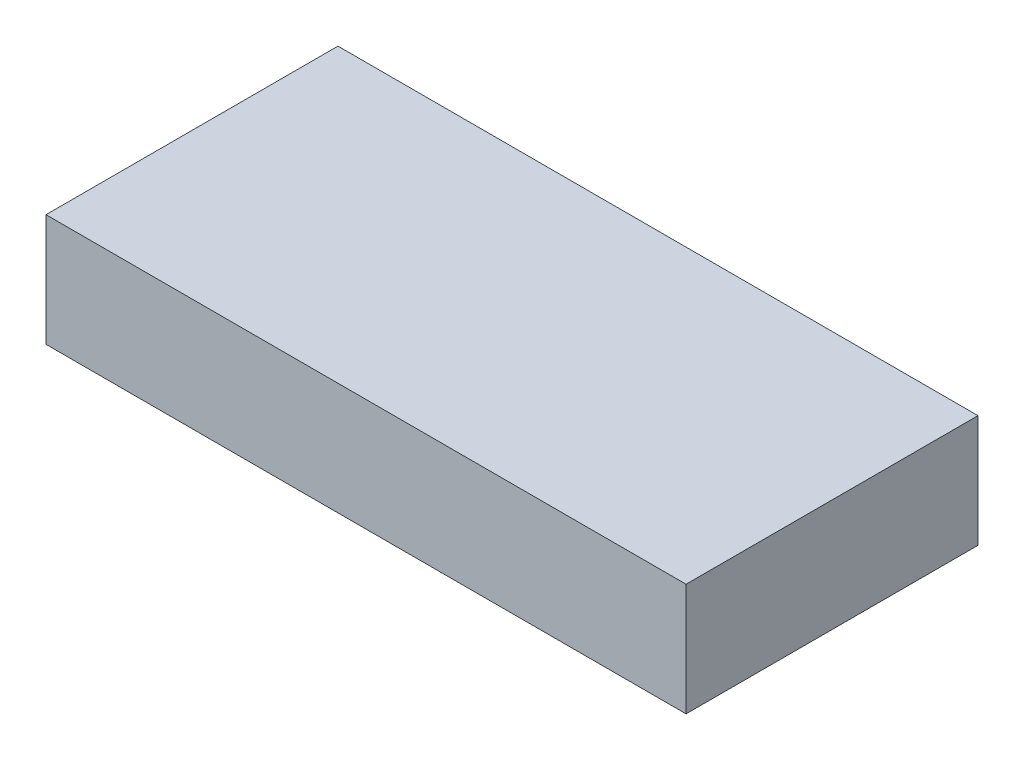
ISO-10303-21;
HEADER;
FILE_DESCRIPTION(('STEP AP214'),'2;1');
FILE_NAME('part.step','',(''),(''),'','','');
FILE_SCHEMA(('AUTOMOTIVE_DESIGN { 1 0 10303 214 1 1 1 1 }'));
ENDSEC;
DATA;
#1=APPLICATION_CONTEXT('core data for automotive mechanical design processes');
#2=APPLICATION_PROTOCOL_DEFINITION('international standard','automotive_design',2000,#1);
#3=PRODUCT_CONTEXT('',#1,'mechanical');
#4=PRODUCT('Part','Part','',(#3));
#5=PRODUCT_RELATED_PRODUCT_CATEGORY('part','',(#4));
#6=PRODUCT_DEFINITION_FORMATION('','',#4);
#7=PRODUCT_DEFINITION_CONTEXT('part definition',#1,'design');
#8=PRODUCT_DEFINITION('design','',#6,#7);
#9=PRODUCT_DEFINITION_SHAPE('','',#8);
#10=(LENGTH_UNIT() NAMED_UNIT(*) SI_UNIT(.MILLI.,.METRE.));
#11=(NAMED_UNIT(*) PLANE_ANGLE_UNIT() SI_UNIT($,.RADIAN.));
#12=(NAMED_UNIT(*) SI_UNIT($,.STERADIAN.) SOLID_ANGLE_UNIT());
#13=UNCERTAINTY_MEASURE_WITH_UNIT(LENGTH_MEASURE(1.E-05),#10,'distance_accuracy_value','');
#14=(GEOMETRIC_REPRESENTATION_CONTEXT(3) GLOBAL_UNCERTAINTY_ASSIGNED_CONTEXT((#13)) GLOBAL_UNIT_ASSIGNED_CONTEXT((#10,
#11,#12)) REPRESENTATION_CONTEXT('',''));
#15=CARTESIAN_POINT('',(0.,0.,0.));
#16=DIRECTION('',(0.,0.,1.));
#17=DIRECTION('',(1.,0.,0.));
#18=AXIS2_PLACEMENT_3D('',#15,#16,#17);
#19=CARTESIAN_POINT('',(0.,5.,0.));
#20=DIRECTION('',(1.,0.,0.));
#21=DIRECTION('',(0.,0.,-1.));
#22=AXIS2_PLACEMENT_3D('',#19,#20,#21);
#23=PLANE('',#22);
#24=DIRECTION('',(0.,0.,1.));
#25=VECTOR('',#24,1.);
#26=CARTESIAN_POINT('',(0.,0.,0.));
#27=LINE('',#26,#25);
#28=CARTESIAN_POINT('',(0.,0.,-13.));
#29=VERTEX_POINT('',#28);
#30=CARTESIAN_POINT('',(0.,0.,0.));
#31=VERTEX_POINT('',#30);
#32=EDGE_CURVE('E97',#29,#31,#27,.T.);
#33=ORIENTED_EDGE('',*,*,#32,.T.);
#34=DIRECTION('',(0.,-1.,0.));
#35=VECTOR('',#34,1.);
#36=CARTESIAN_POINT('',(0.,5.,0.));
#37=LINE('',#36,#35);
#38=CARTESIAN_POINT('',(0.,5.,0.));
#39=VERTEX_POINT('',#38);
#40=EDGE_CURVE('E11',#39,#31,#37,.T.);
#41=ORIENTED_EDGE('',*,*,#40,.F.);
#42=DIRECTION('',(0.,0.,1.));
#43=VECTOR('',#42,1.);
#44=CARTESIAN_POINT('',(0.,5.,0.));
#45=LINE('',#44,#43);
#46=CARTESIAN_POINT('',(0.,5.,-13.));
#47=VERTEX_POINT('',#46);
#48=EDGE_CURVE('E85',#47,#39,#45,.T.);
#49=ORIENTED_EDGE('',*,*,#48,.F.);
#50=DIRECTION('',(0.,-1.,0.));
#51=VECTOR('',#50,1.);
#52=CARTESIAN_POINT('',(0.,5.,-13.));
#53=LINE('',#52,#51);
#54=EDGE_CURVE('E93',#47,#29,#53,.T.);
#55=ORIENTED_EDGE('',*,*,#54,.T.);
#56=EDGE_LOOP('',(#33,#41,#49,#55));
#57=FACE_BOUND('',#56,.T.);
#58=ADVANCED_FACE('F34',(#57),#23,.F.);
#59=CARTESIAN_POINT('',(0.,5.,0.));
#60=DIRECTION('',(0.,0.,-1.));
#61=DIRECTION('',(-1.,0.,0.));
#62=AXIS2_PLACEMENT_3D('',#59,#60,#61);
#63=PLANE('',#62);
#64=DIRECTION('',(1.,0.,0.));
#65=VECTOR('',#64,1.);
#66=CARTESIAN_POINT('',(0.,0.,0.));
#67=LINE('',#66,#65);
#68=CARTESIAN_POINT('',(28.5,0.,0.));
#69=VERTEX_POINT('',#68);
#70=EDGE_CURVE('E89',#31,#69,#67,.T.);
#71=ORIENTED_EDGE('',*,*,#70,.T.);
#72=DIRECTION('',(0.,-1.,0.));
#73=VECTOR('',#72,1.);
#74=CARTESIAN_POINT('',(28.5,5.,0.));
#75=LINE('',#74,#73);
#76=CARTESIAN_POINT('',(28.5,5.,0.));
#77=VERTEX_POINT('',#76);
#78=EDGE_CURVE('E42',#77,#69,#75,.T.);
#79=ORIENTED_EDGE('',*,*,#78,.F.);
#80=DIRECTION('',(1.,0.,0.));
#81=VECTOR('',#80,1.);
#82=CARTESIAN_POINT('',(0.,5.,0.));
#83=LINE('',#82,#81);
#84=EDGE_CURVE('E80',#39,#77,#83,.T.);
#85=ORIENTED_EDGE('',*,*,#84,.F.);
#86=ORIENTED_EDGE('',*,*,#40,.T.);
#87=EDGE_LOOP('',(#71,#79,#85,#86));
#88=FACE_BOUND('',#87,.T.);
#89=ADVANCED_FACE('F88',(#88),#63,.F.);
#90=CARTESIAN_POINT('',(28.5,5.,0.));
#91=DIRECTION('',(-1.,0.,0.));
#92=DIRECTION('',(0.,0.,1.));
#93=AXIS2_PLACEMENT_3D('',#90,#91,#92);
#94=PLANE('',#93);
#95=DIRECTION('',(0.,0.,-1.));
#96=VECTOR('',#95,1.);
#97=CARTESIAN_POINT('',(28.5,0.,0.));
#98=LINE('',#97,#96);
#99=CARTESIAN_POINT('',(28.5,0.,-13.));
#100=VERTEX_POINT('',#99);
#101=EDGE_CURVE('E67',#69,#100,#98,.T.);
#102=ORIENTED_EDGE('',*,*,#101,.T.);
#103=DIRECTION('',(0.,-1.,0.));
#104=VECTOR('',#103,1.);
#105=CARTESIAN_POINT('',(28.5,5.,-13.));
#106=LINE('',#105,#104);
#107=CARTESIAN_POINT('',(28.5,5.,-13.));
#108=VERTEX_POINT('',#107);
#109=EDGE_CURVE('E90',#108,#100,#106,.T.);
#110=ORIENTED_EDGE('',*,*,#109,.F.);
#111=DIRECTION('',(0.,0.,-1.));
#112=VECTOR('',#111,1.);
#113=CARTESIAN_POINT('',(28.5,5.,0.));
#114=LINE('',#113,#112);
#115=EDGE_CURVE('E83',#77,#108,#114,.T.);
#116=ORIENTED_EDGE('',*,*,#115,.F.);
#117=ORIENTED_EDGE('',*,*,#78,.T.);
#118=EDGE_LOOP('',(#102,#110,#116,#117));
#119=FACE_BOUND('',#118,.T.);
#120=ADVANCED_FACE('F91',(#119),#94,.F.);
#121=CARTESIAN_POINT('',(28.5,5.,-13.));
#122=DIRECTION('',(0.,0.,1.));
#123=DIRECTION('',(1.,0.,0.));
#124=AXIS2_PLACEMENT_3D('',#121,#122,#123);
#125=PLANE('',#124);
#126=DIRECTION('',(-1.,0.,0.));
#127=VECTOR('',#126,1.);
#128=CARTESIAN_POINT('',(28.5,0.,-13.));
#129=LINE('',#128,#127);
#130=EDGE_CURVE('E73',#100,#29,#129,.T.);
#131=ORIENTED_EDGE('',*,*,#130,.T.);
#132=ORIENTED_EDGE('',*,*,#54,.F.);
#133=DIRECTION('',(-1.,0.,0.));
#134=VECTOR('',#133,1.);
#135=CARTESIAN_POINT('',(28.5,5.,-13.));
#136=LINE('',#135,#134);
#137=EDGE_CURVE('E50',#108,#47,#136,.T.);
#138=ORIENTED_EDGE('',*,*,#137,.F.);
#139=ORIENTED_EDGE('',*,*,#109,.T.);
#140=EDGE_LOOP('',(#131,#132,#138,#139));
#141=FACE_BOUND('',#140,.T.);
#142=ADVANCED_FACE('F104',(#141),#125,.F.);
#143=CARTESIAN_POINT('',(0.,5.,0.));
#144=DIRECTION('',(0.,1.,0.));
#145=DIRECTION('',(0.,0.,1.));
#146=AXIS2_PLACEMENT_3D('',#143,#144,#145);
#147=PLANE('',#146);
#148=ORIENTED_EDGE('',*,*,#48,.T.);
#149=ORIENTED_EDGE('',*,*,#84,.T.);
#150=ORIENTED_EDGE('',*,*,#115,.T.);
#151=ORIENTED_EDGE('',*,*,#137,.T.);
#152=EDGE_LOOP('',(#148,#149,#150,#151));
#153=FACE_BOUND('',#152,.T.);
#154=ADVANCED_FACE('F81',(#153),#147,.T.);
#155=CARTESIAN_POINT('',(0.,0.,0.));
#156=DIRECTION('',(0.,1.,0.));
#157=DIRECTION('',(0.,0.,1.));
#158=AXIS2_PLACEMENT_3D('',#155,#156,#157);
#159=PLANE('',#158);
#160=ORIENTED_EDGE('',*,*,#32,.F.);
#161=ORIENTED_EDGE('',*,*,#130,.F.);
#162=ORIENTED_EDGE('',*,*,#101,.F.);
#163=ORIENTED_EDGE('',*,*,#70,.F.);
#164=EDGE_LOOP('',(#160,#161,#162,#163));
#165=FACE_BOUND('',#164,.T.);
#166=ADVANCED_FACE('F107',(#165),#159,.F.);
#167=CLOSED_SHELL('',(#58,#89,#120,#142,#154,#166));
#168=MANIFOLD_SOLID_BREP('B2',#167);
#169=ADVANCED_BREP_SHAPE_REPRESENTATION('',(#18,#168),#14);
#170=SHAPE_DEFINITION_REPRESENTATION(#9,#169);
ENDSEC;
END-ISO-10303-21;
